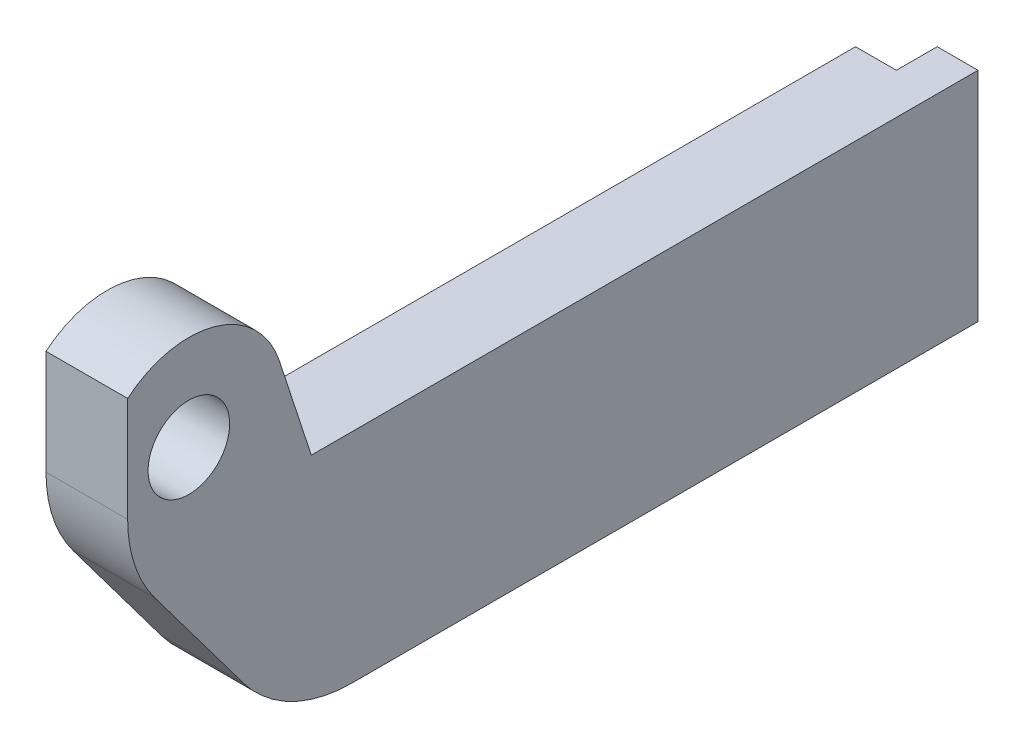
ISO-10303-21;
HEADER;
FILE_DESCRIPTION(('STEP AP214'),'2;1');
FILE_NAME('part.step','',(''),(''),'','','');
FILE_SCHEMA(('AUTOMOTIVE_DESIGN { 1 0 10303 214 1 1 1 1 }'));
ENDSEC;
DATA;
#1=APPLICATION_CONTEXT('core data for automotive mechanical design processes');
#2=APPLICATION_PROTOCOL_DEFINITION('international standard','automotive_design',2000,#1);
#3=PRODUCT_CONTEXT('',#1,'mechanical');
#4=PRODUCT('Part','Part','',(#3));
#5=PRODUCT_RELATED_PRODUCT_CATEGORY('part','',(#4));
#6=PRODUCT_DEFINITION_FORMATION('','',#4);
#7=PRODUCT_DEFINITION_CONTEXT('part definition',#1,'design');
#8=PRODUCT_DEFINITION('design','',#6,#7);
#9=PRODUCT_DEFINITION_SHAPE('','',#8);
#10=(LENGTH_UNIT() NAMED_UNIT(*) SI_UNIT(.MILLI.,.METRE.));
#11=(NAMED_UNIT(*) PLANE_ANGLE_UNIT() SI_UNIT($,.RADIAN.));
#12=(NAMED_UNIT(*) SI_UNIT($,.STERADIAN.) SOLID_ANGLE_UNIT());
#13=UNCERTAINTY_MEASURE_WITH_UNIT(LENGTH_MEASURE(1.E-05),#10,'distance_accuracy_value','');
#14=(GEOMETRIC_REPRESENTATION_CONTEXT(3) GLOBAL_UNCERTAINTY_ASSIGNED_CONTEXT((#13)) GLOBAL_UNIT_ASSIGNED_CONTEXT((#10,
#11,#12)) REPRESENTATION_CONTEXT('',''));
#15=CARTESIAN_POINT('',(0.,0.,0.));
#16=DIRECTION('',(0.,0.,1.));
#17=DIRECTION('',(1.,0.,0.));
#18=AXIS2_PLACEMENT_3D('',#15,#16,#17);
#19=CARTESIAN_POINT('',(0.,77.5,0.));
#20=DIRECTION('',(0.,1.,0.));
#21=DIRECTION('',(0.,0.,1.));
#22=AXIS2_PLACEMENT_3D('',#19,#20,#21);
#23=PLANE('',#22);
#24=DIRECTION('',(0.,0.,-1.));
#25=VECTOR('',#24,1.);
#26=CARTESIAN_POINT('',(-4.,77.5,-23.8150000000001));
#27=LINE('',#26,#25);
#28=CARTESIAN_POINT('',(-4.,77.5,-0.815000000000034));
#29=VERTEX_POINT('',#28);
#30=CARTESIAN_POINT('',(-4.,77.5,-23.8150000000001));
#31=VERTEX_POINT('',#30);
#32=EDGE_CURVE('E166',#29,#31,#27,.T.);
#33=ORIENTED_EDGE('',*,*,#32,.F.);
#34=DIRECTION('',(1.,0.,0.));
#35=VECTOR('',#34,1.);
#36=CARTESIAN_POINT('',(-19.5422810423696,77.5,-0.815000000000034));
#37=LINE('',#36,#35);
#38=CARTESIAN_POINT('',(-1.,77.5,-0.815000000000034));
#39=VERTEX_POINT('',#38);
#40=EDGE_CURVE('E140',#29,#39,#37,.T.);
#41=ORIENTED_EDGE('',*,*,#40,.T.);
#42=DIRECTION('',(0.,0.,1.));
#43=VECTOR('',#42,1.);
#44=CARTESIAN_POINT('',(-0.999999999999999,77.5,0.184999999999965));
#45=LINE('',#44,#43);
#46=CARTESIAN_POINT('',(-0.999999999999999,77.5,-25.3150000000001));
#47=VERTEX_POINT('',#46);
#48=EDGE_CURVE('E178',#47,#39,#45,.T.);
#49=ORIENTED_EDGE('',*,*,#48,.F.);
#50=DIRECTION('',(1.,0.,0.));
#51=VECTOR('',#50,1.);
#52=CARTESIAN_POINT('',(-0.999999999999999,77.5,-25.3150000000001));
#53=LINE('',#52,#51);
#54=CARTESIAN_POINT('',(-2.5,77.5,-25.3150000000001));
#55=VERTEX_POINT('',#54);
#56=EDGE_CURVE('E175',#55,#47,#53,.T.);
#57=ORIENTED_EDGE('',*,*,#56,.F.);
#58=DIRECTION('',(0.,0.,-1.));
#59=VECTOR('',#58,1.);
#60=CARTESIAN_POINT('',(-2.5,77.5,-25.3150000000001));
#61=LINE('',#60,#59);
#62=CARTESIAN_POINT('',(-2.5,77.5,-23.8150000000001));
#63=VERTEX_POINT('',#62);
#64=EDGE_CURVE('E172',#63,#55,#61,.T.);
#65=ORIENTED_EDGE('',*,*,#64,.F.);
#66=DIRECTION('',(1.,0.,0.));
#67=VECTOR('',#66,1.);
#68=CARTESIAN_POINT('',(-2.5,77.5,-23.8150000000001));
#69=LINE('',#68,#67);
#70=EDGE_CURVE('E168',#31,#63,#69,.T.);
#71=ORIENTED_EDGE('',*,*,#70,.F.);
#72=EDGE_LOOP('',(#33,#41,#49,#57,#65,#71));
#73=FACE_BOUND('',#72,.T.);
#74=ADVANCED_FACE('F33',(#73),#23,.T.);
#75=CARTESIAN_POINT('',(-0.999999999999999,77.5,0.184999999999965));
#76=DIRECTION('',(1.,0.,0.));
#77=DIRECTION('',(0.,0.,-1.));
#78=AXIS2_PLACEMENT_3D('',#75,#76,#77);
#79=PLANE('',#78);
#80=DIRECTION('',(0.,1.,0.));
#81=VECTOR('',#80,1.);
#82=CARTESIAN_POINT('',(-1.,82.6809513236909,5.93499999999996));
#83=LINE('',#82,#81);
#84=CARTESIAN_POINT('',(-1.,78.8333333333334,5.93499999999996));
#85=VERTEX_POINT('',#84);
#86=CARTESIAN_POINT('',(-1.,82.6809513236909,5.93499999999996));
#87=VERTEX_POINT('',#86);
#88=EDGE_CURVE('E136',#85,#87,#83,.T.);
#89=ORIENTED_EDGE('',*,*,#88,.F.);
#90=CARTESIAN_POINT('',(-1.,78.8333333333334,0.93499999999996));
#91=DIRECTION('',(1.,0.,0.));
#92=DIRECTION('',(0.,0.,-1.));
#93=AXIS2_PLACEMENT_3D('',#90,#91,#92);
#94=CIRCLE('',#93,5.);
#95=CARTESIAN_POINT('',(-1.,75.8333333333334,4.93499999999997));
#96=VERTEX_POINT('',#95);
#97=EDGE_CURVE('E206',#85,#96,#94,.T.);
#98=ORIENTED_EDGE('',*,*,#97,.T.);
#99=DIRECTION('',(0.,0.800000000000001,0.599999999999999));
#100=VECTOR('',#99,1.);
#101=CARTESIAN_POINT('',(-1.,69.5,0.184999999999963));
#102=LINE('',#101,#100);
#103=CARTESIAN_POINT('',(-1.,71.5,1.68499999999997));
#104=VERTEX_POINT('',#103);
#105=EDGE_CURVE('E157',#104,#96,#102,.T.);
#106=ORIENTED_EDGE('',*,*,#105,.F.);
#107=CARTESIAN_POINT('',(-0.999999999999999,74.5,-2.31500000000003));
#108=DIRECTION('',(1.,0.,0.));
#109=DIRECTION('',(0.,0.,-1.));
#110=AXIS2_PLACEMENT_3D('',#107,#108,#109);
#111=CIRCLE('',#110,5.);
#112=CARTESIAN_POINT('',(-0.999999999999999,69.5,-2.31500000000003));
#113=VERTEX_POINT('',#112);
#114=EDGE_CURVE('E204',#104,#113,#111,.T.);
#115=ORIENTED_EDGE('',*,*,#114,.T.);
#116=DIRECTION('',(0.,0.,1.));
#117=VECTOR('',#116,1.);
#118=CARTESIAN_POINT('',(-0.999999999999999,69.5,0.184999999999963));
#119=LINE('',#118,#117);
#120=CARTESIAN_POINT('',(-0.999999999999999,69.5,-25.3150000000001));
#121=VERTEX_POINT('',#120);
#122=EDGE_CURVE('E169',#121,#113,#119,.T.);
#123=ORIENTED_EDGE('',*,*,#122,.F.);
#124=DIRECTION('',(0.,-1.,0.));
#125=VECTOR('',#124,1.);
#126=CARTESIAN_POINT('',(-0.999999999999999,77.5,-25.3150000000001));
#127=LINE('',#126,#125);
#128=EDGE_CURVE('E194',#47,#121,#127,.T.);
#129=ORIENTED_EDGE('',*,*,#128,.F.);
#130=ORIENTED_EDGE('',*,*,#48,.T.);
#131=DIRECTION('',(0.,-0.950463888456168,-0.3108349992211));
#132=VECTOR('',#131,1.);
#133=CARTESIAN_POINT('',(-1.,77.5,-0.815000000000034));
#134=LINE('',#133,#132);
#135=CARTESIAN_POINT('',(-1.,81.0879224972739,0.358376390403375));
#136=VERTEX_POINT('',#135);
#137=EDGE_CURVE('E155',#136,#39,#134,.T.);
#138=ORIENTED_EDGE('',*,*,#137,.F.);
#139=CARTESIAN_POINT('',(-1.,80.,3.68499999999996));
#140=DIRECTION('',(-1.,0.,0.));
#141=DIRECTION('',(0.,0.,1.));
#142=AXIS2_PLACEMENT_3D('',#139,#140,#141);
#143=CIRCLE('',#142,3.5);
#144=EDGE_CURVE('E149',#87,#136,#143,.T.);
#145=ORIENTED_EDGE('',*,*,#144,.F.);
#146=EDGE_LOOP('',(#89,#98,#106,#115,#123,#129,#130,#138,#145));
#147=FACE_BOUND('',#146,.T.);
#148=CARTESIAN_POINT('',(-1.,80.,3.68499999999996));
#149=DIRECTION('',(-1.,0.,0.));
#150=DIRECTION('',(0.,0.,1.));
#151=AXIS2_PLACEMENT_3D('',#148,#149,#150);
#152=CIRCLE('',#151,1.5);
#153=CARTESIAN_POINT('',(-1.,80.,5.18499999999996));
#154=VERTEX_POINT('',#153);
#155=EDGE_CURVE('E145',#154,#154,#152,.T.);
#156=ORIENTED_EDGE('',*,*,#155,.T.);
#157=EDGE_LOOP('',(#156));
#158=FACE_BOUND('',#157,.T.);
#159=ADVANCED_FACE('F217',(#147,#158),#79,.T.);
#160=CARTESIAN_POINT('',(-0.999999999999999,77.5,-25.3150000000001));
#161=DIRECTION('',(0.,0.,-1.));
#162=DIRECTION('',(0.,1.,0.));
#163=AXIS2_PLACEMENT_3D('',#160,#161,#162);
#164=PLANE('',#163);
#165=DIRECTION('',(1.,0.,0.));
#166=VECTOR('',#165,1.);
#167=CARTESIAN_POINT('',(-0.999999999999999,69.5,-25.3150000000001));
#168=LINE('',#167,#166);
#169=CARTESIAN_POINT('',(-2.5,69.5,-25.3150000000001));
#170=VERTEX_POINT('',#169);
#171=EDGE_CURVE('E189',#170,#121,#168,.T.);
#172=ORIENTED_EDGE('',*,*,#171,.F.);
#173=DIRECTION('',(0.,-1.,0.));
#174=VECTOR('',#173,1.);
#175=CARTESIAN_POINT('',(-2.5,77.5,-25.3150000000001));
#176=LINE('',#175,#174);
#177=EDGE_CURVE('E197',#55,#170,#176,.T.);
#178=ORIENTED_EDGE('',*,*,#177,.F.);
#179=ORIENTED_EDGE('',*,*,#56,.T.);
#180=ORIENTED_EDGE('',*,*,#128,.T.);
#181=EDGE_LOOP('',(#172,#178,#179,#180));
#182=FACE_BOUND('',#181,.T.);
#183=ADVANCED_FACE('F224',(#182),#164,.T.);
#184=CARTESIAN_POINT('',(-2.5,77.5,-25.3150000000001));
#185=DIRECTION('',(-1.,0.,0.));
#186=DIRECTION('',(0.,0.,1.));
#187=AXIS2_PLACEMENT_3D('',#184,#185,#186);
#188=PLANE('',#187);
#189=DIRECTION('',(0.,0.,-1.));
#190=VECTOR('',#189,1.);
#191=CARTESIAN_POINT('',(-2.5,69.5,-25.3150000000001));
#192=LINE('',#191,#190);
#193=CARTESIAN_POINT('',(-2.5,69.5,-23.8150000000001));
#194=VERTEX_POINT('',#193);
#195=EDGE_CURVE('E186',#194,#170,#192,.T.);
#196=ORIENTED_EDGE('',*,*,#195,.F.);
#197=DIRECTION('',(0.,-1.,0.));
#198=VECTOR('',#197,1.);
#199=CARTESIAN_POINT('',(-2.5,77.5,-23.8150000000001));
#200=LINE('',#199,#198);
#201=EDGE_CURVE('E199',#63,#194,#200,.T.);
#202=ORIENTED_EDGE('',*,*,#201,.F.);
#203=ORIENTED_EDGE('',*,*,#64,.T.);
#204=ORIENTED_EDGE('',*,*,#177,.T.);
#205=EDGE_LOOP('',(#196,#202,#203,#204));
#206=FACE_BOUND('',#205,.T.);
#207=ADVANCED_FACE('F239',(#206),#188,.T.);
#208=CARTESIAN_POINT('',(-2.5,77.5,-23.8150000000001));
#209=DIRECTION('',(0.,0.,-1.));
#210=DIRECTION('',(-1.,0.,0.));
#211=AXIS2_PLACEMENT_3D('',#208,#209,#210);
#212=PLANE('',#211);
#213=DIRECTION('',(1.,0.,0.));
#214=VECTOR('',#213,1.);
#215=CARTESIAN_POINT('',(-2.5,69.5,-23.8150000000001));
#216=LINE('',#215,#214);
#217=CARTESIAN_POINT('',(-4.,69.5,-23.8150000000001));
#218=VERTEX_POINT('',#217);
#219=EDGE_CURVE('E183',#218,#194,#216,.T.);
#220=ORIENTED_EDGE('',*,*,#219,.F.);
#221=DIRECTION('',(0.,-1.,0.));
#222=VECTOR('',#221,1.);
#223=CARTESIAN_POINT('',(-4.,77.5,-23.8150000000001));
#224=LINE('',#223,#222);
#225=EDGE_CURVE('E181',#31,#218,#224,.T.);
#226=ORIENTED_EDGE('',*,*,#225,.F.);
#227=ORIENTED_EDGE('',*,*,#70,.T.);
#228=ORIENTED_EDGE('',*,*,#201,.T.);
#229=EDGE_LOOP('',(#220,#226,#227,#228));
#230=FACE_BOUND('',#229,.T.);
#231=ADVANCED_FACE('F237',(#230),#212,.T.);
#232=CARTESIAN_POINT('',(-4.,77.5,-23.8150000000001));
#233=DIRECTION('',(-1.,0.,0.));
#234=DIRECTION('',(0.,0.,1.));
#235=AXIS2_PLACEMENT_3D('',#232,#233,#234);
#236=PLANE('',#235);
#237=DIRECTION('',(0.,0.800000000000001,0.599999999999999));
#238=VECTOR('',#237,1.);
#239=CARTESIAN_POINT('',(-4.,69.5,0.184999999999963));
#240=LINE('',#239,#238);
#241=CARTESIAN_POINT('',(-4.,71.5,1.68499999999997));
#242=VERTEX_POINT('',#241);
#243=CARTESIAN_POINT('',(-4.,75.8333333333334,4.93499999999997));
#244=VERTEX_POINT('',#243);
#245=EDGE_CURVE('E129',#242,#244,#240,.T.);
#246=ORIENTED_EDGE('',*,*,#245,.T.);
#247=CARTESIAN_POINT('',(-4.,78.8333333333334,0.93499999999996));
#248=DIRECTION('',(-1.,0.,0.));
#249=DIRECTION('',(0.,0.,1.));
#250=AXIS2_PLACEMENT_3D('',#247,#248,#249);
#251=CIRCLE('',#250,5.);
#252=CARTESIAN_POINT('',(-4.,78.8333333333334,5.93499999999996));
#253=VERTEX_POINT('',#252);
#254=EDGE_CURVE('E41',#244,#253,#251,.T.);
#255=ORIENTED_EDGE('',*,*,#254,.T.);
#256=DIRECTION('',(0.,1.,0.));
#257=VECTOR('',#256,1.);
#258=CARTESIAN_POINT('',(-4.,82.6809513236909,5.93499999999996));
#259=LINE('',#258,#257);
#260=CARTESIAN_POINT('',(-4.,82.6809513236909,5.93499999999996));
#261=VERTEX_POINT('',#260);
#262=EDGE_CURVE('E118',#253,#261,#259,.T.);
#263=ORIENTED_EDGE('',*,*,#262,.T.);
#264=CARTESIAN_POINT('',(-4.,80.,3.68499999999996));
#265=DIRECTION('',(-1.,0.,0.));
#266=DIRECTION('',(0.,0.,1.));
#267=AXIS2_PLACEMENT_3D('',#264,#265,#266);
#268=CIRCLE('',#267,3.5);
#269=CARTESIAN_POINT('',(-4.,81.0879224972739,0.358376390403375));
#270=VERTEX_POINT('',#269);
#271=EDGE_CURVE('E124',#261,#270,#268,.T.);
#272=ORIENTED_EDGE('',*,*,#271,.T.);
#273=DIRECTION('',(0.,-0.950463888456168,-0.3108349992211));
#274=VECTOR('',#273,1.);
#275=CARTESIAN_POINT('',(-4.,77.5,-0.815000000000034));
#276=LINE('',#275,#274);
#277=EDGE_CURVE('E146',#270,#29,#276,.T.);
#278=ORIENTED_EDGE('',*,*,#277,.T.);
#279=ORIENTED_EDGE('',*,*,#32,.T.);
#280=ORIENTED_EDGE('',*,*,#225,.T.);
#281=DIRECTION('',(0.,0.,-1.));
#282=VECTOR('',#281,1.);
#283=CARTESIAN_POINT('',(-4.,69.5,-23.8150000000001));
#284=LINE('',#283,#282);
#285=CARTESIAN_POINT('',(-4.,69.5,-2.31500000000003));
#286=VERTEX_POINT('',#285);
#287=EDGE_CURVE('E163',#286,#218,#284,.T.);
#288=ORIENTED_EDGE('',*,*,#287,.F.);
#289=CARTESIAN_POINT('',(-4.,74.5,-2.31500000000003));
#290=DIRECTION('',(-1.,0.,0.));
#291=DIRECTION('',(0.,0.,1.));
#292=AXIS2_PLACEMENT_3D('',#289,#290,#291);
#293=CIRCLE('',#292,5.);
#294=EDGE_CURVE('E48',#286,#242,#293,.T.);
#295=ORIENTED_EDGE('',*,*,#294,.T.);
#296=EDGE_LOOP('',(#246,#255,#263,#272,#278,#279,#280,#288,#295));
#297=FACE_BOUND('',#296,.T.);
#298=CARTESIAN_POINT('',(-4.,80.,3.68499999999996));
#299=DIRECTION('',(-1.,0.,0.));
#300=DIRECTION('',(0.,0.,1.));
#301=AXIS2_PLACEMENT_3D('',#298,#299,#300);
#302=CIRCLE('',#301,1.5);
#303=CARTESIAN_POINT('',(-4.,80.,5.18499999999996));
#304=VERTEX_POINT('',#303);
#305=EDGE_CURVE('E130',#304,#304,#302,.T.);
#306=ORIENTED_EDGE('',*,*,#305,.F.);
#307=EDGE_LOOP('',(#306));
#308=FACE_BOUND('',#307,.T.);
#309=ADVANCED_FACE('F120',(#297,#308),#236,.T.);
#310=CARTESIAN_POINT('',(0.,69.5,0.));
#311=DIRECTION('',(0.,1.,0.));
#312=DIRECTION('',(0.,0.,1.));
#313=AXIS2_PLACEMENT_3D('',#310,#311,#312);
#314=PLANE('',#313);
#315=ORIENTED_EDGE('',*,*,#122,.T.);
#316=DIRECTION('',(-1.,0.,0.));
#317=VECTOR('',#316,1.);
#318=CARTESIAN_POINT('',(0.,69.5,-2.31500000000003));
#319=LINE('',#318,#317);
#320=EDGE_CURVE('E11',#113,#286,#319,.T.);
#321=ORIENTED_EDGE('',*,*,#320,.T.);
#322=ORIENTED_EDGE('',*,*,#287,.T.);
#323=ORIENTED_EDGE('',*,*,#219,.T.);
#324=ORIENTED_EDGE('',*,*,#195,.T.);
#325=ORIENTED_EDGE('',*,*,#171,.T.);
#326=EDGE_LOOP('',(#315,#321,#322,#323,#324,#325));
#327=FACE_BOUND('',#326,.T.);
#328=ADVANCED_FACE('F220',(#327),#314,.F.);
#329=CARTESIAN_POINT('',(-19.5422810423696,82.6809513236909,5.93499999999996));
#330=DIRECTION('',(0.,0.,-1.));
#331=DIRECTION('',(-1.,0.,0.));
#332=AXIS2_PLACEMENT_3D('',#329,#330,#331);
#333=PLANE('',#332);
#334=ORIENTED_EDGE('',*,*,#262,.F.);
#335=DIRECTION('',(1.,0.,0.));
#336=VECTOR('',#335,1.);
#337=CARTESIAN_POINT('',(-19.5422810423696,78.8333333333334,5.93499999999996));
#338=LINE('',#337,#336);
#339=EDGE_CURVE('E196',#253,#85,#338,.T.);
#340=ORIENTED_EDGE('',*,*,#339,.T.);
#341=ORIENTED_EDGE('',*,*,#88,.T.);
#342=DIRECTION('',(1.,0.,0.));
#343=VECTOR('',#342,1.);
#344=CARTESIAN_POINT('',(-19.5422810423696,82.6809513236909,5.93499999999996));
#345=LINE('',#344,#343);
#346=EDGE_CURVE('E133',#261,#87,#345,.T.);
#347=ORIENTED_EDGE('',*,*,#346,.F.);
#348=EDGE_LOOP('',(#334,#340,#341,#347));
#349=FACE_BOUND('',#348,.T.);
#350=ADVANCED_FACE('F134',(#349),#333,.F.);
#351=CARTESIAN_POINT('',(-19.5422810423696,69.5,0.184999999999963));
#352=DIRECTION('',(0.,0.599999999999999,-0.800000000000001));
#353=DIRECTION('',(0.,0.800000000000001,0.599999999999999));
#354=AXIS2_PLACEMENT_3D('',#351,#352,#353);
#355=PLANE('',#354);
#356=ORIENTED_EDGE('',*,*,#105,.T.);
#357=DIRECTION('',(1.,0.,0.));
#358=VECTOR('',#357,1.);
#359=CARTESIAN_POINT('',(-19.5422810423696,75.8333333333334,4.93499999999997));
#360=LINE('',#359,#358);
#361=EDGE_CURVE('E55',#96,#244,#360,.F.);
#362=ORIENTED_EDGE('',*,*,#361,.T.);
#363=ORIENTED_EDGE('',*,*,#245,.F.);
#364=DIRECTION('',(-1.,0.,0.));
#365=VECTOR('',#364,1.);
#366=CARTESIAN_POINT('',(-19.5422810423696,71.5,1.68499999999997));
#367=LINE('',#366,#365);
#368=EDGE_CURVE('E208',#242,#104,#367,.F.);
#369=ORIENTED_EDGE('',*,*,#368,.T.);
#370=EDGE_LOOP('',(#356,#362,#363,#369));
#371=FACE_BOUND('',#370,.T.);
#372=ADVANCED_FACE('F212',(#371),#355,.F.);
#373=CARTESIAN_POINT('',(-19.5422810423696,77.5,-0.815000000000034));
#374=DIRECTION('',(0.,-0.3108349992211,0.950463888456168));
#375=DIRECTION('',(0.,-0.950463888456168,-0.3108349992211));
#376=AXIS2_PLACEMENT_3D('',#373,#374,#375);
#377=PLANE('',#376);
#378=ORIENTED_EDGE('',*,*,#277,.F.);
#379=DIRECTION('',(1.,0.,0.));
#380=VECTOR('',#379,1.);
#381=CARTESIAN_POINT('',(-19.5422810423696,81.0879224972739,0.358376390403375));
#382=LINE('',#381,#380);
#383=EDGE_CURVE('E144',#270,#136,#382,.T.);
#384=ORIENTED_EDGE('',*,*,#383,.T.);
#385=ORIENTED_EDGE('',*,*,#137,.T.);
#386=ORIENTED_EDGE('',*,*,#40,.F.);
#387=EDGE_LOOP('',(#378,#384,#385,#386));
#388=FACE_BOUND('',#387,.T.);
#389=ADVANCED_FACE('F233',(#388),#377,.F.);
#390=CARTESIAN_POINT('',(-19.5422810423696,80.,3.68499999999996));
#391=DIRECTION('',(1.,0.,0.));
#392=DIRECTION('',(0.,0.,-1.));
#393=AXIS2_PLACEMENT_3D('',#390,#391,#392);
#394=CYLINDRICAL_SURFACE('',#393,3.5);
#395=ORIENTED_EDGE('',*,*,#271,.F.);
#396=ORIENTED_EDGE('',*,*,#346,.T.);
#397=ORIENTED_EDGE('',*,*,#144,.T.);
#398=ORIENTED_EDGE('',*,*,#383,.F.);
#399=EDGE_LOOP('',(#395,#396,#397,#398));
#400=FACE_BOUND('',#399,.T.);
#401=ADVANCED_FACE('F143',(#400),#394,.T.);
#402=CARTESIAN_POINT('',(-19.5422810423696,80.,3.68499999999996));
#403=DIRECTION('',(1.,0.,0.));
#404=DIRECTION('',(0.,0.,-1.));
#405=AXIS2_PLACEMENT_3D('',#402,#403,#404);
#406=CYLINDRICAL_SURFACE('',#405,1.5);
#407=ORIENTED_EDGE('',*,*,#155,.F.);
#408=EDGE_LOOP('',(#407));
#409=FACE_BOUND('',#408,.T.);
#410=ORIENTED_EDGE('',*,*,#305,.T.);
#411=EDGE_LOOP('',(#410));
#412=FACE_BOUND('',#411,.T.);
#413=ADVANCED_FACE('F268',(#409,#412),#406,.F.);
#414=CARTESIAN_POINT('',(-19.5422810423696,78.8333333333334,0.93499999999996));
#415=DIRECTION('',(1.,0.,0.));
#416=DIRECTION('',(0.,0.,-1.));
#417=AXIS2_PLACEMENT_3D('',#414,#415,#416);
#418=CYLINDRICAL_SURFACE('',#417,5.);
#419=ORIENTED_EDGE('',*,*,#254,.F.);
#420=ORIENTED_EDGE('',*,*,#361,.F.);
#421=ORIENTED_EDGE('',*,*,#97,.F.);
#422=ORIENTED_EDGE('',*,*,#339,.F.);
#423=EDGE_LOOP('',(#419,#420,#421,#422));
#424=FACE_BOUND('',#423,.T.);
#425=ADVANCED_FACE('F266',(#424),#418,.T.);
#426=CARTESIAN_POINT('',(0.,74.5,-2.31500000000003));
#427=DIRECTION('',(-1.,0.,0.));
#428=DIRECTION('',(0.,0.,1.));
#429=AXIS2_PLACEMENT_3D('',#426,#427,#428);
#430=CYLINDRICAL_SURFACE('',#429,5.);
#431=ORIENTED_EDGE('',*,*,#114,.F.);
#432=ORIENTED_EDGE('',*,*,#368,.F.);
#433=ORIENTED_EDGE('',*,*,#294,.F.);
#434=ORIENTED_EDGE('',*,*,#320,.F.);
#435=EDGE_LOOP('',(#431,#432,#433,#434));
#436=FACE_BOUND('',#435,.T.);
#437=ADVANCED_FACE('F35',(#436),#430,.T.);
#438=CLOSED_SHELL('',(#74,#159,#183,#207,#231,#309,#328,#350,#372,#389,#401,#413,#425,#437));
#439=MANIFOLD_SOLID_BREP('B2',#438);
#440=ADVANCED_BREP_SHAPE_REPRESENTATION('',(#18,#439),#14);
#441=SHAPE_DEFINITION_REPRESENTATION(#9,#440);
ENDSEC;
END-ISO-10303-21;
